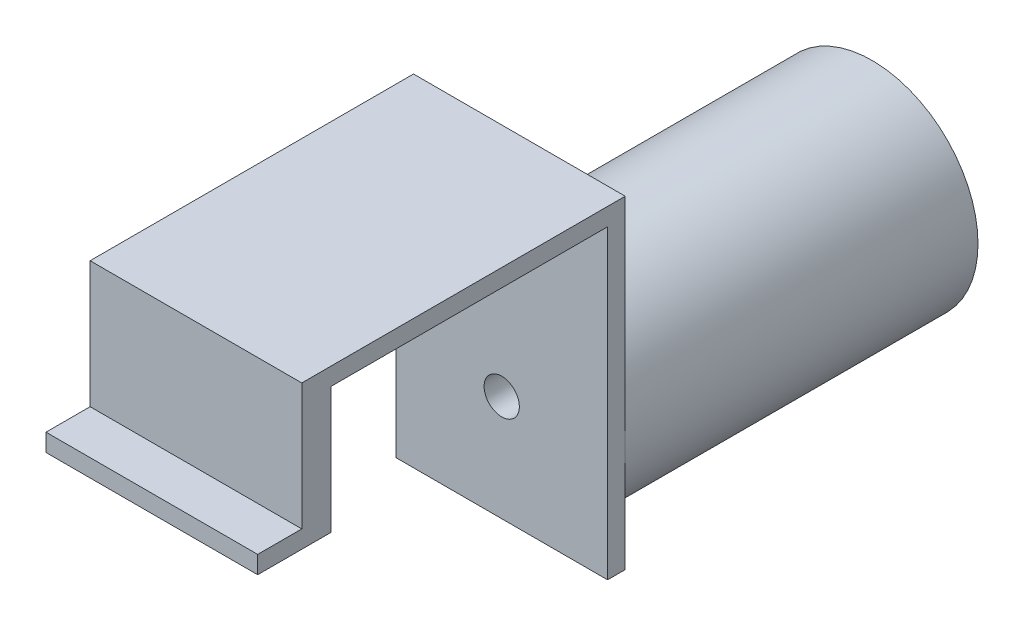
ISO-10303-21;
HEADER;
FILE_DESCRIPTION(('STEP AP214'),'2;1');
FILE_NAME('part.step','',(''),(''),'','','');
FILE_SCHEMA(('AUTOMOTIVE_DESIGN { 1 0 10303 214 1 1 1 1 }'));
ENDSEC;
DATA;
#1=APPLICATION_CONTEXT('core data for automotive mechanical design processes');
#2=APPLICATION_PROTOCOL_DEFINITION('international standard','automotive_design',2000,#1);
#3=PRODUCT_CONTEXT('',#1,'mechanical');
#4=PRODUCT('Part','Part','',(#3));
#5=PRODUCT_RELATED_PRODUCT_CATEGORY('part','',(#4));
#6=PRODUCT_DEFINITION_FORMATION('','',#4);
#7=PRODUCT_DEFINITION_CONTEXT('part definition',#1,'design');
#8=PRODUCT_DEFINITION('design','',#6,#7);
#9=PRODUCT_DEFINITION_SHAPE('','',#8);
#10=(LENGTH_UNIT() NAMED_UNIT(*) SI_UNIT(.MILLI.,.METRE.));
#11=(NAMED_UNIT(*) PLANE_ANGLE_UNIT() SI_UNIT($,.RADIAN.));
#12=(NAMED_UNIT(*) SI_UNIT($,.STERADIAN.) SOLID_ANGLE_UNIT());
#13=UNCERTAINTY_MEASURE_WITH_UNIT(LENGTH_MEASURE(1.E-05),#10,'distance_accuracy_value','');
#14=(GEOMETRIC_REPRESENTATION_CONTEXT(3) GLOBAL_UNCERTAINTY_ASSIGNED_CONTEXT((#13)) GLOBAL_UNIT_ASSIGNED_CONTEXT((#10,
#11,#12)) REPRESENTATION_CONTEXT('',''));
#15=CARTESIAN_POINT('',(0.,0.,0.));
#16=DIRECTION('',(0.,0.,1.));
#17=DIRECTION('',(1.,0.,0.));
#18=AXIS2_PLACEMENT_3D('',#15,#16,#17);
#19=CARTESIAN_POINT('',(0.,0.,115.));
#20=DIRECTION('',(0.,0.,-1.));
#21=DIRECTION('',(-1.,0.,0.));
#22=AXIS2_PLACEMENT_3D('',#19,#20,#21);
#23=PLANE('',#22);
#24=DIRECTION('',(-1.,0.,0.));
#25=VECTOR('',#24,1.);
#26=CARTESIAN_POINT('',(-18.,15.5,115.));
#27=LINE('',#26,#25);
#28=CARTESIAN_POINT('',(18.,15.5,115.));
#29=VERTEX_POINT('',#28);
#30=CARTESIAN_POINT('',(-18.,15.5,115.));
#31=VERTEX_POINT('',#30);
#32=EDGE_CURVE('E50',#29,#31,#27,.T.);
#33=ORIENTED_EDGE('',*,*,#32,.F.);
#34=DIRECTION('',(0.,1.,0.));
#35=VECTOR('',#34,1.);
#36=CARTESIAN_POINT('',(18.,34.,115.));
#37=LINE('',#36,#35);
#38=CARTESIAN_POINT('',(18.,37.,115.));
#39=VERTEX_POINT('',#38);
#40=EDGE_CURVE('E161',#29,#39,#37,.T.);
#41=ORIENTED_EDGE('',*,*,#40,.T.);
#42=DIRECTION('',(-1.,0.,0.));
#43=VECTOR('',#42,1.);
#44=CARTESIAN_POINT('',(-18.,37.,115.));
#45=LINE('',#44,#43);
#46=CARTESIAN_POINT('',(-18.,37.,115.));
#47=VERTEX_POINT('',#46);
#48=EDGE_CURVE('E133',#39,#47,#45,.T.);
#49=ORIENTED_EDGE('',*,*,#48,.T.);
#50=DIRECTION('',(0.,-1.,0.));
#51=VECTOR('',#50,1.);
#52=CARTESIAN_POINT('',(-18.,34.,115.));
#53=LINE('',#52,#51);
#54=EDGE_CURVE('E159',#47,#31,#53,.T.);
#55=ORIENTED_EDGE('',*,*,#54,.T.);
#56=EDGE_LOOP('',(#33,#41,#49,#55));
#57=FACE_BOUND('',#56,.T.);
#58=ADVANCED_FACE('F33',(#57),#23,.F.);
#59=CARTESIAN_POINT('',(0.,0.,63.));
#60=DIRECTION('',(0.,0.,1.));
#61=DIRECTION('',(1.,0.,0.));
#62=AXIS2_PLACEMENT_3D('',#59,#60,#61);
#63=PLANE('',#62);
#64=CARTESIAN_POINT('',(0.,0.,63.));
#65=DIRECTION('',(0.,0.,1.));
#66=DIRECTION('',(1.,0.,0.));
#67=AXIS2_PLACEMENT_3D('',#64,#65,#66);
#68=CIRCLE('',#67,3.);
#69=CARTESIAN_POINT('',(3.,0.,63.));
#70=VERTEX_POINT('',#69);
#71=EDGE_CURVE('E182',#70,#70,#68,.T.);
#72=ORIENTED_EDGE('',*,*,#71,.F.);
#73=EDGE_LOOP('',(#72));
#74=FACE_BOUND('',#73,.T.);
#75=DIRECTION('',(0.,1.,0.));
#76=VECTOR('',#75,1.);
#77=CARTESIAN_POINT('',(18.,37.,63.));
#78=LINE('',#77,#76);
#79=CARTESIAN_POINT('',(18.,-18.,63.));
#80=VERTEX_POINT('',#79);
#81=CARTESIAN_POINT('',(18.,34.,63.));
#82=VERTEX_POINT('',#81);
#83=EDGE_CURVE('E186',#80,#82,#78,.T.);
#84=ORIENTED_EDGE('',*,*,#83,.T.);
#85=DIRECTION('',(-1.,0.,0.));
#86=VECTOR('',#85,1.);
#87=CARTESIAN_POINT('',(18.,34.,63.));
#88=LINE('',#87,#86);
#89=CARTESIAN_POINT('',(-18.,34.,63.));
#90=VERTEX_POINT('',#89);
#91=EDGE_CURVE('E170',#82,#90,#88,.T.);
#92=ORIENTED_EDGE('',*,*,#91,.T.);
#93=DIRECTION('',(0.,-1.,0.));
#94=VECTOR('',#93,1.);
#95=CARTESIAN_POINT('',(-18.,37.,63.));
#96=LINE('',#95,#94);
#97=CARTESIAN_POINT('',(-18.,-18.,63.));
#98=VERTEX_POINT('',#97);
#99=EDGE_CURVE('E189',#90,#98,#96,.T.);
#100=ORIENTED_EDGE('',*,*,#99,.T.);
#101=DIRECTION('',(1.,0.,0.));
#102=VECTOR('',#101,1.);
#103=CARTESIAN_POINT('',(-18.,-18.,63.));
#104=LINE('',#103,#102);
#105=EDGE_CURVE('E192',#98,#80,#104,.T.);
#106=ORIENTED_EDGE('',*,*,#105,.T.);
#107=EDGE_LOOP('',(#84,#92,#100,#106));
#108=FACE_BOUND('',#107,.T.);
#109=ADVANCED_FACE('F249',(#74,#108),#63,.T.);
#110=CARTESIAN_POINT('',(0.,0.,60.));
#111=DIRECTION('',(0.,0.,-1.));
#112=DIRECTION('',(-1.,0.,0.));
#113=AXIS2_PLACEMENT_3D('',#110,#111,#112);
#114=CYLINDRICAL_SURFACE('',#113,18.);
#115=CARTESIAN_POINT('',(0.,0.,60.));
#116=DIRECTION('',(0.,0.,1.));
#117=DIRECTION('',(1.,0.,0.));
#118=AXIS2_PLACEMENT_3D('',#115,#116,#117);
#119=CIRCLE('',#118,18.);
#120=CARTESIAN_POINT('',(18.,0.,60.));
#121=VERTEX_POINT('',#120);
#122=CARTESIAN_POINT('',(-18.,0.,60.));
#123=VERTEX_POINT('',#122);
#124=EDGE_CURVE('E11',#121,#123,#119,.T.);
#125=ORIENTED_EDGE('',*,*,#124,.F.);
#126=CARTESIAN_POINT('',(0.,-18.,60.));
#127=VERTEX_POINT('',#126);
#128=EDGE_CURVE('E43',#127,#121,#119,.T.);
#129=ORIENTED_EDGE('',*,*,#128,.F.);
#130=EDGE_CURVE('E42',#123,#127,#119,.T.);
#131=ORIENTED_EDGE('',*,*,#130,.F.);
#132=EDGE_LOOP('',(#125,#129,#131));
#133=FACE_BOUND('',#132,.T.);
#134=CARTESIAN_POINT('',(0.,0.,0.));
#135=DIRECTION('',(0.,0.,1.));
#136=DIRECTION('',(1.,0.,0.));
#137=AXIS2_PLACEMENT_3D('',#134,#135,#136);
#138=CIRCLE('',#137,18.);
#139=CARTESIAN_POINT('',(18.,0.,0.));
#140=VERTEX_POINT('',#139);
#141=EDGE_CURVE('E37',#140,#140,#138,.T.);
#142=ORIENTED_EDGE('',*,*,#141,.T.);
#143=EDGE_LOOP('',(#142));
#144=FACE_BOUND('',#143,.T.);
#145=ADVANCED_FACE('F35',(#133,#144),#114,.T.);
#146=CARTESIAN_POINT('',(0.,0.,0.));
#147=DIRECTION('',(0.,0.,1.));
#148=DIRECTION('',(1.,0.,0.));
#149=AXIS2_PLACEMENT_3D('',#146,#147,#148);
#150=PLANE('',#149);
#151=CARTESIAN_POINT('',(0.,0.,0.));
#152=DIRECTION('',(0.,0.,1.));
#153=DIRECTION('',(1.,0.,0.));
#154=AXIS2_PLACEMENT_3D('',#151,#152,#153);
#155=CIRCLE('',#154,3.);
#156=CARTESIAN_POINT('',(3.,0.,0.));
#157=VERTEX_POINT('',#156);
#158=EDGE_CURVE('E179',#157,#157,#155,.T.);
#159=ORIENTED_EDGE('',*,*,#158,.T.);
#160=EDGE_LOOP('',(#159));
#161=FACE_BOUND('',#160,.T.);
#162=ORIENTED_EDGE('',*,*,#141,.F.);
#163=EDGE_LOOP('',(#162));
#164=FACE_BOUND('',#163,.T.);
#165=ADVANCED_FACE('F248',(#161,#164),#150,.F.);
#166=CARTESIAN_POINT('',(0.,0.,60.));
#167=DIRECTION('',(0.,0.,1.));
#168=DIRECTION('',(1.,0.,0.));
#169=AXIS2_PLACEMENT_3D('',#166,#167,#168);
#170=PLANE('',#169);
#171=DIRECTION('',(0.,1.,0.));
#172=VECTOR('',#171,1.);
#173=CARTESIAN_POINT('',(18.,37.,60.));
#174=LINE('',#173,#172);
#175=CARTESIAN_POINT('',(18.,37.,60.));
#176=VERTEX_POINT('',#175);
#177=EDGE_CURVE('E185',#121,#176,#174,.T.);
#178=ORIENTED_EDGE('',*,*,#177,.F.);
#179=ORIENTED_EDGE('',*,*,#124,.T.);
#180=DIRECTION('',(0.,-1.,0.));
#181=VECTOR('',#180,1.);
#182=CARTESIAN_POINT('',(-18.,37.,60.));
#183=LINE('',#182,#181);
#184=CARTESIAN_POINT('',(-18.,37.,60.));
#185=VERTEX_POINT('',#184);
#186=EDGE_CURVE('E200',#185,#123,#183,.T.);
#187=ORIENTED_EDGE('',*,*,#186,.F.);
#188=DIRECTION('',(-1.,0.,0.));
#189=VECTOR('',#188,1.);
#190=CARTESIAN_POINT('',(-18.,37.,60.));
#191=LINE('',#190,#189);
#192=EDGE_CURVE('E197',#176,#185,#191,.T.);
#193=ORIENTED_EDGE('',*,*,#192,.F.);
#194=EDGE_LOOP('',(#178,#179,#187,#193));
#195=FACE_BOUND('',#194,.T.);
#196=ADVANCED_FACE('F246',(#195),#170,.F.);
#197=CARTESIAN_POINT('',(-18.,-18.,60.));
#198=VERTEX_POINT('',#197);
#199=EDGE_CURVE('E199',#123,#198,#183,.T.);
#200=ORIENTED_EDGE('',*,*,#199,.F.);
#201=ORIENTED_EDGE('',*,*,#130,.T.);
#202=DIRECTION('',(1.,0.,0.));
#203=VECTOR('',#202,1.);
#204=CARTESIAN_POINT('',(-18.,-18.,60.));
#205=LINE('',#204,#203);
#206=EDGE_CURVE('E190',#198,#127,#205,.T.);
#207=ORIENTED_EDGE('',*,*,#206,.F.);
#208=EDGE_LOOP('',(#200,#201,#207));
#209=FACE_BOUND('',#208,.T.);
#210=ADVANCED_FACE('F231',(#209),#170,.F.);
#211=CARTESIAN_POINT('',(18.,-18.,60.));
#212=VERTEX_POINT('',#211);
#213=EDGE_CURVE('E203',#127,#212,#205,.T.);
#214=ORIENTED_EDGE('',*,*,#213,.F.);
#215=ORIENTED_EDGE('',*,*,#128,.T.);
#216=EDGE_CURVE('E195',#212,#121,#174,.T.);
#217=ORIENTED_EDGE('',*,*,#216,.F.);
#218=EDGE_LOOP('',(#214,#215,#217));
#219=FACE_BOUND('',#218,.T.);
#220=ADVANCED_FACE('F233',(#219),#170,.F.);
#221=CARTESIAN_POINT('',(18.,37.,63.));
#222=DIRECTION('',(-1.,0.,0.));
#223=DIRECTION('',(0.,-1.,0.));
#224=AXIS2_PLACEMENT_3D('',#221,#222,#223);
#225=PLANE('',#224);
#226=ORIENTED_EDGE('',*,*,#216,.T.);
#227=ORIENTED_EDGE('',*,*,#177,.T.);
#228=DIRECTION('',(0.,0.,-1.));
#229=VECTOR('',#228,1.);
#230=CARTESIAN_POINT('',(18.,37.,63.));
#231=LINE('',#230,#229);
#232=EDGE_CURVE('E214',#39,#176,#231,.T.);
#233=ORIENTED_EDGE('',*,*,#232,.F.);
#234=ORIENTED_EDGE('',*,*,#40,.F.);
#235=DIRECTION('',(0.,0.,-1.));
#236=VECTOR('',#235,1.);
#237=CARTESIAN_POINT('',(18.,15.5,122.5));
#238=LINE('',#237,#236);
#239=CARTESIAN_POINT('',(18.,15.5,122.5));
#240=VERTEX_POINT('',#239);
#241=EDGE_CURVE('E140',#240,#29,#238,.T.);
#242=ORIENTED_EDGE('',*,*,#241,.F.);
#243=DIRECTION('',(0.,1.,0.));
#244=VECTOR('',#243,1.);
#245=CARTESIAN_POINT('',(18.,15.5,122.5));
#246=LINE('',#245,#244);
#247=CARTESIAN_POINT('',(18.,12.5,122.5));
#248=VERTEX_POINT('',#247);
#249=EDGE_CURVE('E136',#248,#240,#246,.T.);
#250=ORIENTED_EDGE('',*,*,#249,.F.);
#251=DIRECTION('',(0.,0.,-1.));
#252=VECTOR('',#251,1.);
#253=CARTESIAN_POINT('',(18.,12.5,115.));
#254=LINE('',#253,#252);
#255=CARTESIAN_POINT('',(18.,12.5,110.));
#256=VERTEX_POINT('',#255);
#257=EDGE_CURVE('E122',#248,#256,#254,.T.);
#258=ORIENTED_EDGE('',*,*,#257,.T.);
#259=DIRECTION('',(0.,1.,0.));
#260=VECTOR('',#259,1.);
#261=CARTESIAN_POINT('',(18.,37.,110.));
#262=LINE('',#261,#260);
#263=CARTESIAN_POINT('',(18.,34.,110.));
#264=VERTEX_POINT('',#263);
#265=EDGE_CURVE('E162',#256,#264,#262,.T.);
#266=ORIENTED_EDGE('',*,*,#265,.T.);
#267=DIRECTION('',(0.,0.,-1.));
#268=VECTOR('',#267,1.);
#269=CARTESIAN_POINT('',(18.,34.,110.));
#270=LINE('',#269,#268);
#271=EDGE_CURVE('E176',#264,#82,#270,.T.);
#272=ORIENTED_EDGE('',*,*,#271,.T.);
#273=ORIENTED_EDGE('',*,*,#83,.F.);
#274=DIRECTION('',(0.,0.,-1.));
#275=VECTOR('',#274,1.);
#276=CARTESIAN_POINT('',(18.,-18.,63.));
#277=LINE('',#276,#275);
#278=EDGE_CURVE('E194',#80,#212,#277,.T.);
#279=ORIENTED_EDGE('',*,*,#278,.T.);
#280=EDGE_LOOP('',(#226,#227,#233,#234,#242,#250,#258,#266,#272,#273,#279));
#281=FACE_BOUND('',#280,.T.);
#282=ADVANCED_FACE('F138',(#281),#225,.F.);
#283=CARTESIAN_POINT('',(-18.,37.,63.));
#284=DIRECTION('',(0.,-1.,0.));
#285=DIRECTION('',(0.,0.,-1.));
#286=AXIS2_PLACEMENT_3D('',#283,#284,#285);
#287=PLANE('',#286);
#288=ORIENTED_EDGE('',*,*,#192,.T.);
#289=DIRECTION('',(0.,0.,-1.));
#290=VECTOR('',#289,1.);
#291=CARTESIAN_POINT('',(-18.,37.,63.));
#292=LINE('',#291,#290);
#293=EDGE_CURVE('E211',#47,#185,#292,.T.);
#294=ORIENTED_EDGE('',*,*,#293,.F.);
#295=ORIENTED_EDGE('',*,*,#48,.F.);
#296=ORIENTED_EDGE('',*,*,#232,.T.);
#297=EDGE_LOOP('',(#288,#294,#295,#296));
#298=FACE_BOUND('',#297,.T.);
#299=ADVANCED_FACE('F284',(#298),#287,.F.);
#300=CARTESIAN_POINT('',(-18.,37.,63.));
#301=DIRECTION('',(1.,0.,0.));
#302=DIRECTION('',(0.,1.,0.));
#303=AXIS2_PLACEMENT_3D('',#300,#301,#302);
#304=PLANE('',#303);
#305=ORIENTED_EDGE('',*,*,#186,.T.);
#306=ORIENTED_EDGE('',*,*,#199,.T.);
#307=DIRECTION('',(0.,0.,-1.));
#308=VECTOR('',#307,1.);
#309=CARTESIAN_POINT('',(-18.,-18.,63.));
#310=LINE('',#309,#308);
#311=EDGE_CURVE('E208',#98,#198,#310,.T.);
#312=ORIENTED_EDGE('',*,*,#311,.F.);
#313=ORIENTED_EDGE('',*,*,#99,.F.);
#314=DIRECTION('',(0.,0.,1.));
#315=VECTOR('',#314,1.);
#316=CARTESIAN_POINT('',(-18.,34.,63.));
#317=LINE('',#316,#315);
#318=CARTESIAN_POINT('',(-18.,34.,110.));
#319=VERTEX_POINT('',#318);
#320=EDGE_CURVE('E58',#90,#319,#317,.T.);
#321=ORIENTED_EDGE('',*,*,#320,.T.);
#322=DIRECTION('',(0.,-1.,0.));
#323=VECTOR('',#322,1.);
#324=CARTESIAN_POINT('',(-18.,12.5,110.));
#325=LINE('',#324,#323);
#326=CARTESIAN_POINT('',(-18.,12.5,110.));
#327=VERTEX_POINT('',#326);
#328=EDGE_CURVE('E158',#319,#327,#325,.T.);
#329=ORIENTED_EDGE('',*,*,#328,.T.);
#330=DIRECTION('',(0.,0.,-1.));
#331=VECTOR('',#330,1.);
#332=CARTESIAN_POINT('',(-18.,12.5,115.));
#333=LINE('',#332,#331);
#334=CARTESIAN_POINT('',(-18.,12.5,122.5));
#335=VERTEX_POINT('',#334);
#336=EDGE_CURVE('E132',#335,#327,#333,.T.);
#337=ORIENTED_EDGE('',*,*,#336,.F.);
#338=DIRECTION('',(0.,-1.,0.));
#339=VECTOR('',#338,1.);
#340=CARTESIAN_POINT('',(-18.,12.5,122.5));
#341=LINE('',#340,#339);
#342=CARTESIAN_POINT('',(-18.,15.5,122.5));
#343=VERTEX_POINT('',#342);
#344=EDGE_CURVE('E148',#343,#335,#341,.T.);
#345=ORIENTED_EDGE('',*,*,#344,.F.);
#346=DIRECTION('',(0.,0.,-1.));
#347=VECTOR('',#346,1.);
#348=CARTESIAN_POINT('',(-18.,15.5,122.5));
#349=LINE('',#348,#347);
#350=EDGE_CURVE('E153',#343,#31,#349,.T.);
#351=ORIENTED_EDGE('',*,*,#350,.T.);
#352=ORIENTED_EDGE('',*,*,#54,.F.);
#353=ORIENTED_EDGE('',*,*,#293,.T.);
#354=EDGE_LOOP('',(#305,#306,#312,#313,#321,#329,#337,#345,#351,#352,#353));
#355=FACE_BOUND('',#354,.T.);
#356=ADVANCED_FACE('F241',(#355),#304,.F.);
#357=CARTESIAN_POINT('',(-18.,-18.,63.));
#358=DIRECTION('',(0.,1.,0.));
#359=DIRECTION('',(0.,0.,1.));
#360=AXIS2_PLACEMENT_3D('',#357,#358,#359);
#361=PLANE('',#360);
#362=ORIENTED_EDGE('',*,*,#206,.T.);
#363=ORIENTED_EDGE('',*,*,#213,.T.);
#364=ORIENTED_EDGE('',*,*,#278,.F.);
#365=ORIENTED_EDGE('',*,*,#105,.F.);
#366=ORIENTED_EDGE('',*,*,#311,.T.);
#367=EDGE_LOOP('',(#362,#363,#364,#365,#366));
#368=FACE_BOUND('',#367,.T.);
#369=ADVANCED_FACE('F236',(#368),#361,.F.);
#370=CARTESIAN_POINT('',(0.,0.,63.));
#371=DIRECTION('',(0.,0.,-1.));
#372=DIRECTION('',(-1.,0.,0.));
#373=AXIS2_PLACEMENT_3D('',#370,#371,#372);
#374=CYLINDRICAL_SURFACE('',#373,3.);
#375=ORIENTED_EDGE('',*,*,#71,.T.);
#376=EDGE_LOOP('',(#375));
#377=FACE_BOUND('',#376,.T.);
#378=ORIENTED_EDGE('',*,*,#158,.F.);
#379=EDGE_LOOP('',(#378));
#380=FACE_BOUND('',#379,.T.);
#381=ADVANCED_FACE('F274',(#377,#380),#374,.F.);
#382=CARTESIAN_POINT('',(0.,34.,0.));
#383=DIRECTION('',(0.,1.,0.));
#384=DIRECTION('',(0.,0.,1.));
#385=AXIS2_PLACEMENT_3D('',#382,#383,#384);
#386=PLANE('',#385);
#387=ORIENTED_EDGE('',*,*,#91,.F.);
#388=ORIENTED_EDGE('',*,*,#271,.F.);
#389=DIRECTION('',(1.,0.,0.));
#390=VECTOR('',#389,1.);
#391=CARTESIAN_POINT('',(-18.,34.,110.));
#392=LINE('',#391,#390);
#393=EDGE_CURVE('E173',#319,#264,#392,.T.);
#394=ORIENTED_EDGE('',*,*,#393,.F.);
#395=ORIENTED_EDGE('',*,*,#320,.F.);
#396=EDGE_LOOP('',(#387,#388,#394,#395));
#397=FACE_BOUND('',#396,.T.);
#398=ADVANCED_FACE('F271',(#397),#386,.F.);
#399=CARTESIAN_POINT('',(18.,12.5,115.));
#400=DIRECTION('',(0.,1.,0.));
#401=DIRECTION('',(-1.,0.,0.));
#402=AXIS2_PLACEMENT_3D('',#399,#400,#401);
#403=PLANE('',#402);
#404=DIRECTION('',(1.,0.,0.));
#405=VECTOR('',#404,1.);
#406=CARTESIAN_POINT('',(18.,12.5,110.));
#407=LINE('',#406,#405);
#408=EDGE_CURVE('E129',#327,#256,#407,.T.);
#409=ORIENTED_EDGE('',*,*,#408,.T.);
#410=ORIENTED_EDGE('',*,*,#257,.F.);
#411=DIRECTION('',(1.,0.,0.));
#412=VECTOR('',#411,1.);
#413=CARTESIAN_POINT('',(18.,12.5,122.5));
#414=LINE('',#413,#412);
#415=EDGE_CURVE('E127',#335,#248,#414,.T.);
#416=ORIENTED_EDGE('',*,*,#415,.F.);
#417=ORIENTED_EDGE('',*,*,#336,.T.);
#418=EDGE_LOOP('',(#409,#410,#416,#417));
#419=FACE_BOUND('',#418,.T.);
#420=ADVANCED_FACE('F124',(#419),#403,.F.);
#421=CARTESIAN_POINT('',(0.,0.,110.));
#422=DIRECTION('',(0.,0.,-1.));
#423=DIRECTION('',(-1.,0.,0.));
#424=AXIS2_PLACEMENT_3D('',#421,#422,#423);
#425=PLANE('',#424);
#426=ORIENTED_EDGE('',*,*,#328,.F.);
#427=ORIENTED_EDGE('',*,*,#393,.T.);
#428=ORIENTED_EDGE('',*,*,#265,.F.);
#429=ORIENTED_EDGE('',*,*,#408,.F.);
#430=EDGE_LOOP('',(#426,#427,#428,#429));
#431=FACE_BOUND('',#430,.T.);
#432=ADVANCED_FACE('F265',(#431),#425,.T.);
#433=CARTESIAN_POINT('',(-18.,15.5,122.5));
#434=DIRECTION('',(0.,-1.,0.));
#435=DIRECTION('',(0.,0.,-1.));
#436=AXIS2_PLACEMENT_3D('',#433,#434,#435);
#437=PLANE('',#436);
#438=ORIENTED_EDGE('',*,*,#32,.T.);
#439=ORIENTED_EDGE('',*,*,#350,.F.);
#440=DIRECTION('',(-1.,0.,0.));
#441=VECTOR('',#440,1.);
#442=CARTESIAN_POINT('',(-18.,15.5,122.5));
#443=LINE('',#442,#441);
#444=EDGE_CURVE('E143',#240,#343,#443,.T.);
#445=ORIENTED_EDGE('',*,*,#444,.F.);
#446=ORIENTED_EDGE('',*,*,#241,.T.);
#447=EDGE_LOOP('',(#438,#439,#445,#446));
#448=FACE_BOUND('',#447,.T.);
#449=ADVANCED_FACE('F263',(#448),#437,.F.);
#450=CARTESIAN_POINT('',(0.,0.,122.5));
#451=DIRECTION('',(0.,0.,-1.));
#452=DIRECTION('',(-1.,0.,0.));
#453=AXIS2_PLACEMENT_3D('',#450,#451,#452);
#454=PLANE('',#453);
#455=ORIENTED_EDGE('',*,*,#415,.T.);
#456=ORIENTED_EDGE('',*,*,#249,.T.);
#457=ORIENTED_EDGE('',*,*,#444,.T.);
#458=ORIENTED_EDGE('',*,*,#344,.T.);
#459=EDGE_LOOP('',(#455,#456,#457,#458));
#460=FACE_BOUND('',#459,.T.);
#461=ADVANCED_FACE('F146',(#460),#454,.F.);
#462=CLOSED_SHELL('',(#58,#109,#145,#165,#196,#210,#220,#282,#299,#356,#369,#381,#398,#420,#432,
#449,#461));
#463=MANIFOLD_SOLID_BREP('B2',#462);
#464=ADVANCED_BREP_SHAPE_REPRESENTATION('',(#18,#463),#14);
#465=SHAPE_DEFINITION_REPRESENTATION(#9,#464);
ENDSEC;
END-ISO-10303-21;
